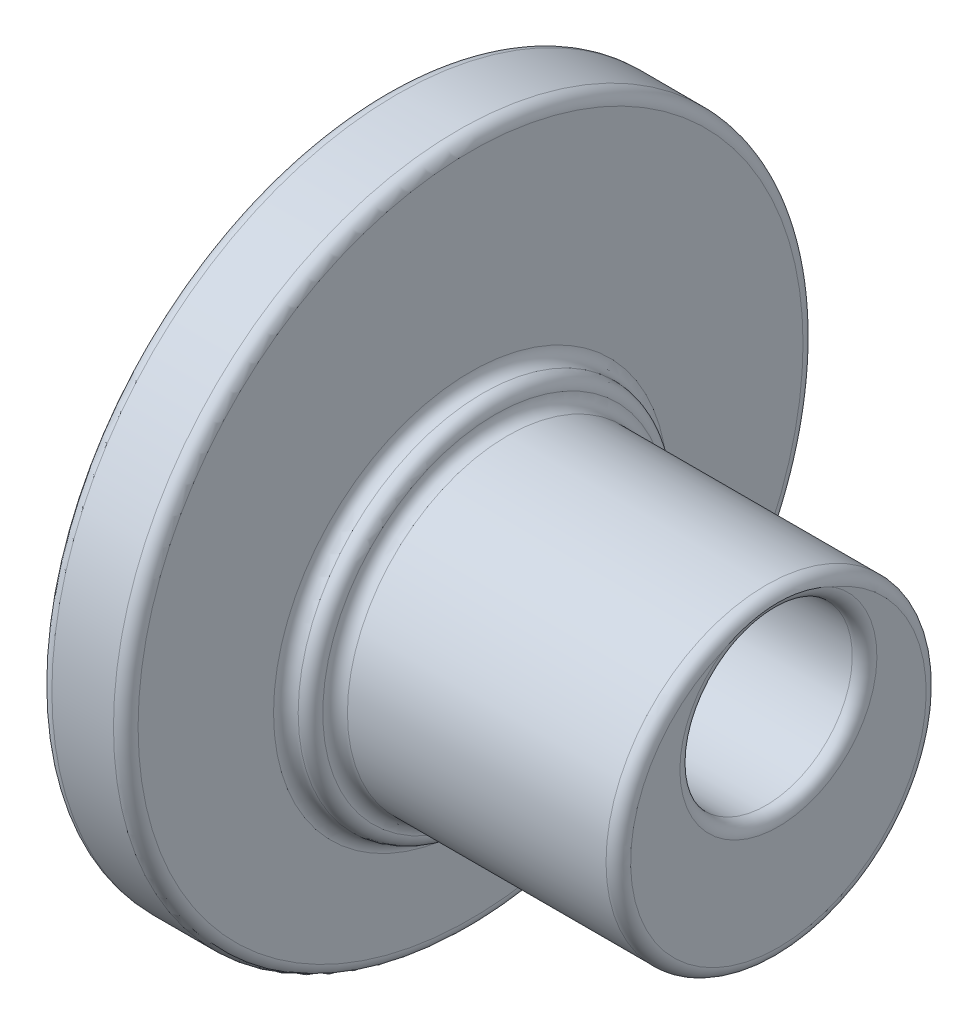
ISO-10303-21;
HEADER;
FILE_DESCRIPTION(('STEP AP214'),'2;1');
FILE_NAME('part.step','',(''),(''),'','','');
FILE_SCHEMA(('AUTOMOTIVE_DESIGN { 1 0 10303 214 1 1 1 1 }'));
ENDSEC;
DATA;
#1=APPLICATION_CONTEXT('core data for automotive mechanical design processes');
#2=APPLICATION_PROTOCOL_DEFINITION('international standard','automotive_design',2000,#1);
#3=PRODUCT_CONTEXT('',#1,'mechanical');
#4=PRODUCT('Part','Part','',(#3));
#5=PRODUCT_RELATED_PRODUCT_CATEGORY('part','',(#4));
#6=PRODUCT_DEFINITION_FORMATION('','',#4);
#7=PRODUCT_DEFINITION_CONTEXT('part definition',#1,'design');
#8=PRODUCT_DEFINITION('design','',#6,#7);
#9=PRODUCT_DEFINITION_SHAPE('','',#8);
#10=(LENGTH_UNIT() NAMED_UNIT(*) SI_UNIT(.MILLI.,.METRE.));
#11=(NAMED_UNIT(*) PLANE_ANGLE_UNIT() SI_UNIT($,.RADIAN.));
#12=(NAMED_UNIT(*) SI_UNIT($,.STERADIAN.) SOLID_ANGLE_UNIT());
#13=UNCERTAINTY_MEASURE_WITH_UNIT(LENGTH_MEASURE(1.E-05),#10,'distance_accuracy_value','');
#14=(GEOMETRIC_REPRESENTATION_CONTEXT(3) GLOBAL_UNCERTAINTY_ASSIGNED_CONTEXT((#13)) GLOBAL_UNIT_ASSIGNED_CONTEXT((#10,
#11,#12)) REPRESENTATION_CONTEXT('',''));
#15=CARTESIAN_POINT('',(0.,0.,0.));
#16=DIRECTION('',(0.,0.,1.));
#17=DIRECTION('',(1.,0.,0.));
#18=AXIS2_PLACEMENT_3D('',#15,#16,#17);
#19=CARTESIAN_POINT('',(0.,0.,0.));
#20=DIRECTION('',(1.,0.,0.));
#21=DIRECTION('',(0.,0.,-1.));
#22=AXIS2_PLACEMENT_3D('',#19,#20,#21);
#23=PLANE('',#22);
#24=CARTESIAN_POINT('',(0.,0.,0.));
#25=DIRECTION('',(1.,0.,0.));
#26=DIRECTION('',(0.,0.,-1.));
#27=AXIS2_PLACEMENT_3D('',#24,#25,#26);
#28=CIRCLE('',#27,54.);
#29=CARTESIAN_POINT('',(0.,0.,-54.));
#30=VERTEX_POINT('',#29);
#31=EDGE_CURVE('E11',#30,#30,#28,.F.);
#32=ORIENTED_EDGE('',*,*,#31,.T.);
#33=EDGE_LOOP('',(#32));
#34=FACE_BOUND('',#33,.T.);
#35=CARTESIAN_POINT('',(0.,0.,0.));
#36=DIRECTION('',(1.,0.,0.));
#37=DIRECTION('',(0.,0.,-1.));
#38=AXIS2_PLACEMENT_3D('',#35,#36,#37);
#39=CIRCLE('',#38,26.5);
#40=CARTESIAN_POINT('',(0.,0.,-26.5));
#41=VERTEX_POINT('',#40);
#42=EDGE_CURVE('E40',#41,#41,#39,.T.);
#43=ORIENTED_EDGE('',*,*,#42,.T.);
#44=EDGE_LOOP('',(#43));
#45=FACE_BOUND('',#44,.T.);
#46=ADVANCED_FACE('F31',(#34,#45),#23,.F.);
#47=CARTESIAN_POINT('',(0.,0.,0.));
#48=DIRECTION('',(-1.,0.,0.));
#49=DIRECTION('',(0.,0.,1.));
#50=AXIS2_PLACEMENT_3D('',#47,#48,#49);
#51=CYLINDRICAL_SURFACE('',#50,56.);
#52=CARTESIAN_POINT('',(12.,0.,0.));
#53=DIRECTION('',(-1.,0.,0.));
#54=DIRECTION('',(0.,0.,1.));
#55=AXIS2_PLACEMENT_3D('',#52,#53,#54);
#56=CIRCLE('',#55,56.);
#57=CARTESIAN_POINT('',(12.,0.,56.));
#58=VERTEX_POINT('',#57);
#59=EDGE_CURVE('E175',#58,#58,#56,.T.);
#60=ORIENTED_EDGE('',*,*,#59,.T.);
#61=EDGE_LOOP('',(#60));
#62=FACE_BOUND('',#61,.T.);
#63=CARTESIAN_POINT('',(2.,0.,0.));
#64=DIRECTION('',(1.,0.,0.));
#65=DIRECTION('',(0.,0.,-1.));
#66=AXIS2_PLACEMENT_3D('',#63,#64,#65);
#67=CIRCLE('',#66,56.);
#68=CARTESIAN_POINT('',(2.,0.,-56.));
#69=VERTEX_POINT('',#68);
#70=EDGE_CURVE('E172',#69,#69,#67,.T.);
#71=ORIENTED_EDGE('',*,*,#70,.T.);
#72=EDGE_LOOP('',(#71));
#73=FACE_BOUND('',#72,.T.);
#74=ADVANCED_FACE('F117',(#62,#73),#51,.T.);
#75=CARTESIAN_POINT('',(14.,56.,0.));
#76=DIRECTION('',(-1.,0.,0.));
#77=DIRECTION('',(0.,0.,1.));
#78=AXIS2_PLACEMENT_3D('',#75,#76,#77);
#79=PLANE('',#78);
#80=CARTESIAN_POINT('',(14.,-9.,0.));
#81=DIRECTION('',(-1.,0.,0.));
#82=DIRECTION('',(0.,0.,1.));
#83=AXIS2_PLACEMENT_3D('',#80,#81,#82);
#84=CIRCLE('',#83,32.);
#85=CARTESIAN_POINT('',(14.,-9.,32.));
#86=VERTEX_POINT('',#85);
#87=EDGE_CURVE('E169',#86,#86,#84,.T.);
#88=ORIENTED_EDGE('',*,*,#87,.T.);
#89=EDGE_LOOP('',(#88));
#90=FACE_BOUND('',#89,.T.);
#91=CARTESIAN_POINT('',(14.,0.,0.));
#92=DIRECTION('',(-1.,0.,0.));
#93=DIRECTION('',(0.,0.,1.));
#94=AXIS2_PLACEMENT_3D('',#91,#92,#93);
#95=CIRCLE('',#94,54.);
#96=CARTESIAN_POINT('',(14.,0.,54.));
#97=VERTEX_POINT('',#96);
#98=EDGE_CURVE('E166',#97,#97,#95,.F.);
#99=ORIENTED_EDGE('',*,*,#98,.T.);
#100=EDGE_LOOP('',(#99));
#101=FACE_BOUND('',#100,.T.);
#102=ADVANCED_FACE('F122',(#90,#101),#79,.F.);
#103=CARTESIAN_POINT('',(10.,0.,0.));
#104=DIRECTION('',(-1.,0.,0.));
#105=DIRECTION('',(0.,0.,1.));
#106=AXIS2_PLACEMENT_3D('',#103,#104,#105);
#107=CYLINDRICAL_SURFACE('',#106,24.5);
#108=CARTESIAN_POINT('',(8.,0.,0.));
#109=DIRECTION('',(-1.,0.,0.));
#110=DIRECTION('',(0.,0.,1.));
#111=AXIS2_PLACEMENT_3D('',#108,#109,#110);
#112=CIRCLE('',#111,24.5);
#113=CARTESIAN_POINT('',(8.,0.,24.5));
#114=VERTEX_POINT('',#113);
#115=EDGE_CURVE('E187',#114,#114,#112,.F.);
#116=ORIENTED_EDGE('',*,*,#115,.T.);
#117=EDGE_LOOP('',(#116));
#118=FACE_BOUND('',#117,.T.);
#119=CARTESIAN_POINT('',(2.,0.,0.));
#120=DIRECTION('',(1.,0.,0.));
#121=DIRECTION('',(0.,0.,-1.));
#122=AXIS2_PLACEMENT_3D('',#119,#120,#121);
#123=CIRCLE('',#122,24.5);
#124=CARTESIAN_POINT('',(2.,0.,-24.5));
#125=VERTEX_POINT('',#124);
#126=EDGE_CURVE('E184',#125,#125,#123,.F.);
#127=ORIENTED_EDGE('',*,*,#126,.T.);
#128=EDGE_LOOP('',(#127));
#129=FACE_BOUND('',#128,.T.);
#130=ADVANCED_FACE('F129',(#118,#129),#107,.F.);
#131=CARTESIAN_POINT('',(10.,0.,0.));
#132=DIRECTION('',(-1.,0.,0.));
#133=DIRECTION('',(0.,0.,1.));
#134=AXIS2_PLACEMENT_3D('',#131,#132,#133);
#135=PLANE('',#134);
#136=CARTESIAN_POINT('',(10.,0.,0.));
#137=DIRECTION('',(-1.,0.,0.));
#138=DIRECTION('',(0.,0.,1.));
#139=AXIS2_PLACEMENT_3D('',#136,#137,#138);
#140=CIRCLE('',#139,16.);
#141=CARTESIAN_POINT('',(10.,0.,16.));
#142=VERTEX_POINT('',#141);
#143=EDGE_CURVE('E181',#142,#142,#140,.F.);
#144=ORIENTED_EDGE('',*,*,#143,.T.);
#145=EDGE_LOOP('',(#144));
#146=FACE_BOUND('',#145,.T.);
#147=CARTESIAN_POINT('',(10.,0.,0.));
#148=DIRECTION('',(-1.,0.,0.));
#149=DIRECTION('',(0.,0.,1.));
#150=AXIS2_PLACEMENT_3D('',#147,#148,#149);
#151=CIRCLE('',#150,22.5);
#152=CARTESIAN_POINT('',(10.,0.,22.5));
#153=VERTEX_POINT('',#152);
#154=EDGE_CURVE('E178',#153,#153,#151,.T.);
#155=ORIENTED_EDGE('',*,*,#154,.T.);
#156=EDGE_LOOP('',(#155));
#157=FACE_BOUND('',#156,.T.);
#158=ADVANCED_FACE('F133',(#146,#157),#135,.T.);
#159=CARTESIAN_POINT('',(58.5999429340862,-8.99999999999999,0.));
#160=DIRECTION('',(1.,0.,0.));
#161=DIRECTION('',(0.,1.,0.));
#162=AXIS2_PLACEMENT_3D('',#159,#160,#161);
#163=CYLINDRICAL_SURFACE('',#162,26.);
#164=CARTESIAN_POINT('',(62.,-8.99999999999999,0.));
#165=DIRECTION('',(1.,0.,0.));
#166=DIRECTION('',(0.,1.,0.));
#167=AXIS2_PLACEMENT_3D('',#164,#165,#166);
#168=CIRCLE('',#167,26.);
#169=CARTESIAN_POINT('',(62.,17.,0.));
#170=VERTEX_POINT('',#169);
#171=EDGE_CURVE('E163',#170,#170,#168,.F.);
#172=ORIENTED_EDGE('',*,*,#171,.T.);
#173=EDGE_LOOP('',(#172));
#174=FACE_BOUND('',#173,.T.);
#175=CARTESIAN_POINT('',(20.,-9.,0.));
#176=DIRECTION('',(1.,0.,0.));
#177=DIRECTION('',(0.,1.,0.));
#178=AXIS2_PLACEMENT_3D('',#175,#176,#177);
#179=CIRCLE('',#178,26.);
#180=CARTESIAN_POINT('',(20.,17.,0.));
#181=VERTEX_POINT('',#180);
#182=EDGE_CURVE('E157',#181,#181,#179,.T.);
#183=ORIENTED_EDGE('',*,*,#182,.T.);
#184=EDGE_LOOP('',(#183));
#185=FACE_BOUND('',#184,.T.);
#186=ADVANCED_FACE('F137',(#174,#185),#163,.T.);
#187=CARTESIAN_POINT('',(64.,17.,0.));
#188=DIRECTION('',(1.,0.,0.));
#189=DIRECTION('',(0.,1.,0.));
#190=AXIS2_PLACEMENT_3D('',#187,#188,#189);
#191=PLANE('',#190);
#192=CARTESIAN_POINT('',(64.,-8.99999999999999,0.));
#193=DIRECTION('',(1.,0.,0.));
#194=DIRECTION('',(0.,1.,0.));
#195=AXIS2_PLACEMENT_3D('',#192,#193,#194);
#196=CIRCLE('',#195,24.);
#197=CARTESIAN_POINT('',(64.,13.2777777777778,8.92752022030481));
#198=VERTEX_POINT('',#197);
#199=CARTESIAN_POINT('',(64.,13.2777777777778,-8.92752022030481));
#200=VERTEX_POINT('',#199);
#201=EDGE_CURVE('E54',#198,#200,#196,.T.);
#202=ORIENTED_EDGE('',*,*,#201,.T.);
#203=CARTESIAN_POINT('',(64.,0.,0.));
#204=DIRECTION('',(1.,0.,0.));
#205=DIRECTION('',(0.,1.,0.));
#206=AXIS2_PLACEMENT_3D('',#203,#204,#205);
#207=CIRCLE('',#206,16.);
#208=CARTESIAN_POINT('',(64.,0.,16.));
#209=VERTEX_POINT('',#208);
#210=EDGE_CURVE('E58',#200,#209,#207,.F.);
#211=ORIENTED_EDGE('',*,*,#210,.T.);
#212=CARTESIAN_POINT('',(64.,0.,0.));
#213=DIRECTION('',(1.,0.,0.));
#214=DIRECTION('',(0.,1.,0.));
#215=AXIS2_PLACEMENT_3D('',#212,#213,#214);
#216=CIRCLE('',#215,16.);
#217=EDGE_CURVE('E48',#209,#198,#216,.F.);
#218=ORIENTED_EDGE('',*,*,#217,.T.);
#219=EDGE_LOOP('',(#202,#211,#218));
#220=FACE_BOUND('',#219,.T.);
#221=ADVANCED_FACE('F57',(#220),#191,.T.);
#222=CARTESIAN_POINT('',(64.,0.,0.));
#223=DIRECTION('',(-1.,0.,0.));
#224=DIRECTION('',(0.,0.,1.));
#225=AXIS2_PLACEMENT_3D('',#222,#223,#224);
#226=CYLINDRICAL_SURFACE('',#225,14.);
#227=CARTESIAN_POINT('',(62.,0.,0.));
#228=DIRECTION('',(1.,0.,0.));
#229=DIRECTION('',(0.,1.,0.));
#230=AXIS2_PLACEMENT_3D('',#227,#228,#229);
#231=CIRCLE('',#230,14.);
#232=CARTESIAN_POINT('',(62.,14.,0.));
#233=VERTEX_POINT('',#232);
#234=EDGE_CURVE('E151',#233,#233,#231,.T.);
#235=ORIENTED_EDGE('',*,*,#234,.T.);
#236=EDGE_LOOP('',(#235));
#237=FACE_BOUND('',#236,.T.);
#238=CARTESIAN_POINT('',(12.,0.,0.));
#239=DIRECTION('',(-1.,0.,0.));
#240=DIRECTION('',(0.,0.,1.));
#241=AXIS2_PLACEMENT_3D('',#238,#239,#240);
#242=CIRCLE('',#241,14.);
#243=CARTESIAN_POINT('',(12.,0.,14.));
#244=VERTEX_POINT('',#243);
#245=EDGE_CURVE('E154',#244,#244,#242,.T.);
#246=ORIENTED_EDGE('',*,*,#245,.T.);
#247=EDGE_LOOP('',(#246));
#248=FACE_BOUND('',#247,.T.);
#249=ADVANCED_FACE('F79',(#237,#248),#226,.F.);
#250=CARTESIAN_POINT('',(62.,-8.99999999999999,0.));
#251=DIRECTION('',(1.,0.,0.));
#252=DIRECTION('',(0.,1.,0.));
#253=AXIS2_PLACEMENT_3D('',#250,#251,#252);
#254=TOROIDAL_SURFACE('',#253,24.,2.);
#255=ORIENTED_EDGE('',*,*,#171,.F.);
#256=EDGE_LOOP('',(#255));
#257=FACE_BOUND('',#256,.T.);
#258=CARTESIAN_POINT('',(64.,13.2777777777778,-8.92752022030481));
#259=CARTESIAN_POINT('',(63.9999999976024,13.2808252981056,-8.92175879319629));
#260=CARTESIAN_POINT('',(63.9999996450213,13.283869918335,-8.91599577711117));
#261=CARTESIAN_POINT('',(63.9999268153815,13.5999313648674,-8.31700265554182));
#262=CARTESIAN_POINT('',(63.9961659166586,13.8822185500573,-7.7069833605264));
#263=CARTESIAN_POINT('',(63.9853236327415,14.3816521865303,-6.45993638329273));
#264=CARTESIAN_POINT('',(63.9782368625066,14.598692055056,-5.82286642947155));
#265=CARTESIAN_POINT('',(63.9655534257185,14.9269866646494,-4.66188093729165));
#266=CARTESIAN_POINT('',(63.9599486321505,15.050800557683,-4.14149167806664));
#267=CARTESIAN_POINT('',(63.9500739069937,15.2542537191447,-3.09194646967929));
#268=CARTESIAN_POINT('',(63.9458043755093,15.3338797524316,-2.56278794276946));
#269=CARTESIAN_POINT('',(63.9395038851617,15.4482927470198,-1.49910228907747));
#270=CARTESIAN_POINT('',(63.9374751590785,15.483034991117,-0.96457034216534));
#271=CARTESIAN_POINT('',(63.9360721469476,15.5072461072939,0.105465509632225));
#272=CARTESIAN_POINT('',(63.9366975711915,15.4967199205559,0.640969302060002));
#273=CARTESIAN_POINT('',(63.9404758499881,15.4305206533453,1.70872273356214));
#274=CARTESIAN_POINT('',(63.9436266193142,15.3748848203494,2.24097469252738));
#275=CARTESIAN_POINT('',(63.9518090764821,15.2189584601954,3.29897033638768));
#276=CARTESIAN_POINT('',(63.9568410614283,15.1186608790388,3.82471297969642));
#277=CARTESIAN_POINT('',(63.9676674871789,14.8744725276062,4.86488199961767));
#278=CARTESIAN_POINT('',(63.9734604528593,14.7306654130038,5.37932807800726));
#279=CARTESIAN_POINT('',(63.9843345831724,14.4005921941502,6.39418368933527));
#280=CARTESIAN_POINT('',(63.9894161334987,14.214349241517,6.89460070950695));
#281=CARTESIAN_POINT('',(63.9952652319883,13.8987078130998,7.64547425029885));
#282=CARTESIAN_POINT('',(63.9969364820634,13.7840731158234,7.90223561359764));
#283=CARTESIAN_POINT('',(63.9992878836495,13.5437271182563,8.41037306474065));
#284=CARTESIAN_POINT('',(63.9999686543623,13.4180227903628,8.66175242022454));
#285=CARTESIAN_POINT('',(63.9999996468308,13.2838699263769,8.91599575282353));
#286=CARTESIAN_POINT('',(63.9999999994384,13.2808253060847,8.92175876895344));
#287=CARTESIAN_POINT('',(64.,13.2777777777778,8.92752022030481));
#288=B_SPLINE_CURVE_WITH_KNOTS('',3,(#258,#259,#260,#261,#262,#263,#264,#265,#266,#267,#268,
#269,#270,#271,#272,#273,#274,#275,#276,#277,#278,#279,#280,#281,#282,#283,#284,#285,#286,#287),
.UNSPECIFIED.,.F.,.F.,(4,2,2,2,2,2,2,2,2,2,2,2,2,2,4),(0.,0.0195534766019155,2.03177926894599,
4.04727443016575,5.65027383360541,7.25375310840448,8.8588286823458,10.4637290620169,
12.0673056076413,13.6711355164103,15.2719011331322,16.8717955062659,17.7151642197969,
18.5580054715111,18.5775589481165),.UNSPECIFIED.);
#289=EDGE_CURVE('E62',#200,#198,#288,.T.);
#290=ORIENTED_EDGE('',*,*,#289,.F.);
#291=ORIENTED_EDGE('',*,*,#201,.F.);
#292=EDGE_LOOP('',(#290,#291));
#293=FACE_BOUND('',#292,.T.);
#294=ADVANCED_FACE('F61',(#257,#293),#254,.T.);
#295=CARTESIAN_POINT('',(62.,0.,0.));
#296=DIRECTION('',(1.,0.,0.));
#297=DIRECTION('',(0.,1.,0.));
#298=AXIS2_PLACEMENT_3D('',#295,#296,#297);
#299=TOROIDAL_SURFACE('',#298,16.,2.);
#300=ORIENTED_EDGE('',*,*,#234,.F.);
#301=EDGE_LOOP('',(#300));
#302=FACE_BOUND('',#301,.T.);
#303=ORIENTED_EDGE('',*,*,#210,.F.);
#304=ORIENTED_EDGE('',*,*,#289,.T.);
#305=ORIENTED_EDGE('',*,*,#217,.F.);
#306=EDGE_LOOP('',(#303,#304,#305));
#307=FACE_BOUND('',#306,.T.);
#308=ADVANCED_FACE('F64',(#302,#307),#299,.T.);
#309=CARTESIAN_POINT('',(16.,-9.,0.));
#310=DIRECTION('',(-1.,0.,0.));
#311=DIRECTION('',(0.,0.,1.));
#312=AXIS2_PLACEMENT_3D('',#309,#310,#311);
#313=TOROIDAL_SURFACE('',#312,32.,2.);
#314=ORIENTED_EDGE('',*,*,#87,.F.);
#315=EDGE_LOOP('',(#314));
#316=FACE_BOUND('',#315,.T.);
#317=CARTESIAN_POINT('',(16.,-9.,0.));
#318=DIRECTION('',(-1.,0.,0.));
#319=DIRECTION('',(0.,0.,1.));
#320=AXIS2_PLACEMENT_3D('',#317,#318,#319);
#321=CIRCLE('',#320,30.);
#322=CARTESIAN_POINT('',(16.,-9.,30.));
#323=VERTEX_POINT('',#322);
#324=EDGE_CURVE('E35',#323,#323,#321,.F.);
#325=ORIENTED_EDGE('',*,*,#324,.F.);
#326=EDGE_LOOP('',(#325));
#327=FACE_BOUND('',#326,.T.);
#328=ADVANCED_FACE('F83',(#316,#327),#313,.F.);
#329=CARTESIAN_POINT('',(16.,-9.,0.));
#330=DIRECTION('',(1.,0.,0.));
#331=DIRECTION('',(0.,1.,0.));
#332=AXIS2_PLACEMENT_3D('',#329,#330,#331);
#333=TOROIDAL_SURFACE('',#332,28.,2.);
#334=ORIENTED_EDGE('',*,*,#324,.T.);
#335=EDGE_LOOP('',(#334));
#336=FACE_BOUND('',#335,.T.);
#337=CARTESIAN_POINT('',(18.,-9.,0.));
#338=DIRECTION('',(1.,0.,0.));
#339=DIRECTION('',(0.,1.,0.));
#340=AXIS2_PLACEMENT_3D('',#337,#338,#339);
#341=CIRCLE('',#340,28.);
#342=CARTESIAN_POINT('',(18.,19.,0.));
#343=VERTEX_POINT('',#342);
#344=EDGE_CURVE('E67',#343,#343,#341,.T.);
#345=ORIENTED_EDGE('',*,*,#344,.F.);
#346=EDGE_LOOP('',(#345));
#347=FACE_BOUND('',#346,.T.);
#348=ADVANCED_FACE('F89',(#336,#347),#333,.T.);
#349=CARTESIAN_POINT('',(20.,-9.,0.));
#350=DIRECTION('',(1.,0.,0.));
#351=DIRECTION('',(0.,1.,0.));
#352=AXIS2_PLACEMENT_3D('',#349,#350,#351);
#353=TOROIDAL_SURFACE('',#352,28.,2.);
#354=ORIENTED_EDGE('',*,*,#344,.T.);
#355=EDGE_LOOP('',(#354));
#356=FACE_BOUND('',#355,.T.);
#357=ORIENTED_EDGE('',*,*,#182,.F.);
#358=EDGE_LOOP('',(#357));
#359=FACE_BOUND('',#358,.T.);
#360=ADVANCED_FACE('F85',(#356,#359),#353,.F.);
#361=CARTESIAN_POINT('',(12.,0.,0.));
#362=DIRECTION('',(-1.,0.,0.));
#363=DIRECTION('',(0.,0.,1.));
#364=AXIS2_PLACEMENT_3D('',#361,#362,#363);
#365=TOROIDAL_SURFACE('',#364,54.,2.);
#366=ORIENTED_EDGE('',*,*,#98,.F.);
#367=EDGE_LOOP('',(#366));
#368=FACE_BOUND('',#367,.T.);
#369=ORIENTED_EDGE('',*,*,#59,.F.);
#370=EDGE_LOOP('',(#369));
#371=FACE_BOUND('',#370,.T.);
#372=ADVANCED_FACE('F88',(#368,#371),#365,.T.);
#373=CARTESIAN_POINT('',(12.,0.,0.));
#374=DIRECTION('',(-1.,0.,0.));
#375=DIRECTION('',(0.,0.,1.));
#376=AXIS2_PLACEMENT_3D('',#373,#374,#375);
#377=TOROIDAL_SURFACE('',#376,16.,2.);
#378=ORIENTED_EDGE('',*,*,#143,.F.);
#379=EDGE_LOOP('',(#378));
#380=FACE_BOUND('',#379,.T.);
#381=ORIENTED_EDGE('',*,*,#245,.F.);
#382=EDGE_LOOP('',(#381));
#383=FACE_BOUND('',#382,.T.);
#384=ADVANCED_FACE('F99',(#380,#383),#377,.T.);
#385=CARTESIAN_POINT('',(8.,0.,0.));
#386=DIRECTION('',(-1.,0.,0.));
#387=DIRECTION('',(0.,0.,1.));
#388=AXIS2_PLACEMENT_3D('',#385,#386,#387);
#389=TOROIDAL_SURFACE('',#388,22.5,2.);
#390=ORIENTED_EDGE('',*,*,#115,.F.);
#391=EDGE_LOOP('',(#390));
#392=FACE_BOUND('',#391,.T.);
#393=ORIENTED_EDGE('',*,*,#154,.F.);
#394=EDGE_LOOP('',(#393));
#395=FACE_BOUND('',#394,.T.);
#396=ADVANCED_FACE('F103',(#392,#395),#389,.F.);
#397=CARTESIAN_POINT('',(2.,0.,0.));
#398=DIRECTION('',(1.,0.,0.));
#399=DIRECTION('',(0.,0.,-1.));
#400=AXIS2_PLACEMENT_3D('',#397,#398,#399);
#401=TOROIDAL_SURFACE('',#400,54.,2.);
#402=ORIENTED_EDGE('',*,*,#70,.F.);
#403=EDGE_LOOP('',(#402));
#404=FACE_BOUND('',#403,.T.);
#405=ORIENTED_EDGE('',*,*,#31,.F.);
#406=EDGE_LOOP('',(#405));
#407=FACE_BOUND('',#406,.T.);
#408=ADVANCED_FACE('F106',(#404,#407),#401,.T.);
#409=CARTESIAN_POINT('',(2.,0.,0.));
#410=DIRECTION('',(1.,0.,0.));
#411=DIRECTION('',(0.,0.,-1.));
#412=AXIS2_PLACEMENT_3D('',#409,#410,#411);
#413=TOROIDAL_SURFACE('',#412,26.5,2.);
#414=ORIENTED_EDGE('',*,*,#42,.F.);
#415=EDGE_LOOP('',(#414));
#416=FACE_BOUND('',#415,.T.);
#417=ORIENTED_EDGE('',*,*,#126,.F.);
#418=EDGE_LOOP('',(#417));
#419=FACE_BOUND('',#418,.T.);
#420=ADVANCED_FACE('F33',(#416,#419),#413,.T.);
#421=CLOSED_SHELL('',(#46,#74,#102,#130,#158,#186,#221,#249,#294,#308,#328,#348,#360,#372,#384,
#396,#408,#420));
#422=MANIFOLD_SOLID_BREP('B2',#421);
#423=ADVANCED_BREP_SHAPE_REPRESENTATION('',(#18,#422),#14);
#424=SHAPE_DEFINITION_REPRESENTATION(#9,#423);
ENDSEC;
END-ISO-10303-21;
